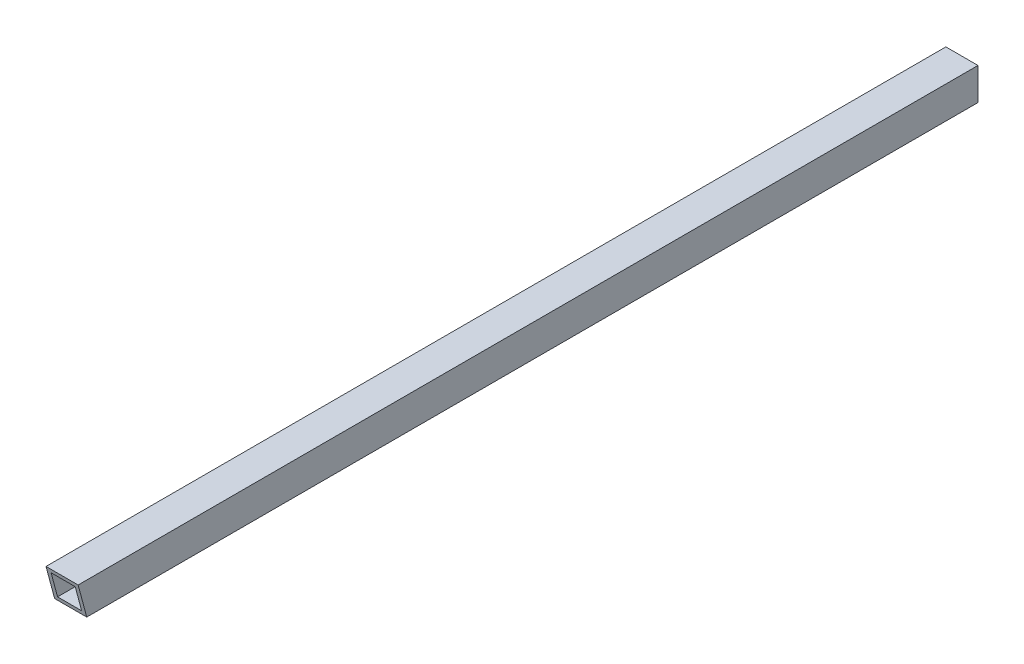
ISO-10303-21;
HEADER;
FILE_DESCRIPTION(('STEP AP214'),'2;1');
FILE_NAME('part.step','',(''),(''),'','','');
FILE_SCHEMA(('AUTOMOTIVE_DESIGN { 1 0 10303 214 1 1 1 1 }'));
ENDSEC;
DATA;
#1=APPLICATION_CONTEXT('core data for automotive mechanical design processes');
#2=APPLICATION_PROTOCOL_DEFINITION('international standard','automotive_design',2000,#1);
#3=PRODUCT_CONTEXT('',#1,'mechanical');
#4=PRODUCT('Part','Part','',(#3));
#5=PRODUCT_RELATED_PRODUCT_CATEGORY('part','',(#4));
#6=PRODUCT_DEFINITION_FORMATION('','',#4);
#7=PRODUCT_DEFINITION_CONTEXT('part definition',#1,'design');
#8=PRODUCT_DEFINITION('design','',#6,#7);
#9=PRODUCT_DEFINITION_SHAPE('','',#8);
#10=(LENGTH_UNIT() NAMED_UNIT(*) SI_UNIT(.MILLI.,.METRE.));
#11=(NAMED_UNIT(*) PLANE_ANGLE_UNIT() SI_UNIT($,.RADIAN.));
#12=(NAMED_UNIT(*) SI_UNIT($,.STERADIAN.) SOLID_ANGLE_UNIT());
#13=UNCERTAINTY_MEASURE_WITH_UNIT(LENGTH_MEASURE(1.E-05),#10,'distance_accuracy_value','');
#14=(GEOMETRIC_REPRESENTATION_CONTEXT(3) GLOBAL_UNCERTAINTY_ASSIGNED_CONTEXT((#13)) GLOBAL_UNIT_ASSIGNED_CONTEXT((#10,
#11,#12)) REPRESENTATION_CONTEXT('',''));
#15=CARTESIAN_POINT('',(0.,0.,0.));
#16=DIRECTION('',(0.,0.,1.));
#17=DIRECTION('',(1.,0.,0.));
#18=AXIS2_PLACEMENT_3D('',#15,#16,#17);
#19=CARTESIAN_POINT('',(0.,0.,0.));
#20=DIRECTION('',(0.,0.,1.));
#21=DIRECTION('',(1.,0.,0.));
#22=AXIS2_PLACEMENT_3D('',#19,#20,#21);
#23=PLANE('',#22);
#24=DIRECTION('',(0.,-1.,0.));
#25=VECTOR('',#24,1.);
#26=CARTESIAN_POINT('',(-12.7,-12.7,0.));
#27=LINE('',#26,#25);
#28=CARTESIAN_POINT('',(-12.7,12.7,0.));
#29=VERTEX_POINT('',#28);
#30=CARTESIAN_POINT('',(-12.7,-12.7,0.));
#31=VERTEX_POINT('',#30);
#32=EDGE_CURVE('E135',#29,#31,#27,.T.);
#33=ORIENTED_EDGE('',*,*,#32,.F.);
#34=DIRECTION('',(-1.,0.,0.));
#35=VECTOR('',#34,1.);
#36=CARTESIAN_POINT('',(12.7,12.7,0.));
#37=LINE('',#36,#35);
#38=CARTESIAN_POINT('',(12.7,12.7,0.));
#39=VERTEX_POINT('',#38);
#40=EDGE_CURVE('E108',#39,#29,#37,.T.);
#41=ORIENTED_EDGE('',*,*,#40,.F.);
#42=DIRECTION('',(0.,1.,0.));
#43=VECTOR('',#42,1.);
#44=CARTESIAN_POINT('',(12.7,-12.7,0.));
#45=LINE('',#44,#43);
#46=CARTESIAN_POINT('',(12.7,-12.7,0.));
#47=VERTEX_POINT('',#46);
#48=EDGE_CURVE('E136',#47,#39,#45,.T.);
#49=ORIENTED_EDGE('',*,*,#48,.F.);
#50=DIRECTION('',(1.,0.,0.));
#51=VECTOR('',#50,1.);
#52=CARTESIAN_POINT('',(12.7,-12.7,0.));
#53=LINE('',#52,#51);
#54=EDGE_CURVE('E131',#31,#47,#53,.T.);
#55=ORIENTED_EDGE('',*,*,#54,.F.);
#56=EDGE_LOOP('',(#33,#41,#49,#55));
#57=FACE_BOUND('',#56,.T.);
#58=DIRECTION('',(0.,-1.,0.));
#59=VECTOR('',#58,1.);
#60=CARTESIAN_POINT('',(-9.525,-9.525,0.));
#61=LINE('',#60,#59);
#62=CARTESIAN_POINT('',(-9.525,9.52500000000001,0.));
#63=VERTEX_POINT('',#62);
#64=CARTESIAN_POINT('',(-9.525,-9.525,0.));
#65=VERTEX_POINT('',#64);
#66=EDGE_CURVE('E152',#63,#65,#61,.T.);
#67=ORIENTED_EDGE('',*,*,#66,.T.);
#68=DIRECTION('',(1.,0.,0.));
#69=VECTOR('',#68,1.);
#70=CARTESIAN_POINT('',(9.525,-9.525,0.));
#71=LINE('',#70,#69);
#72=CARTESIAN_POINT('',(9.525,-9.525,0.));
#73=VERTEX_POINT('',#72);
#74=EDGE_CURVE('E155',#65,#73,#71,.T.);
#75=ORIENTED_EDGE('',*,*,#74,.T.);
#76=DIRECTION('',(0.,1.,0.));
#77=VECTOR('',#76,1.);
#78=CARTESIAN_POINT('',(9.525,-9.525,0.));
#79=LINE('',#78,#77);
#80=CARTESIAN_POINT('',(9.525,9.52500000000001,0.));
#81=VERTEX_POINT('',#80);
#82=EDGE_CURVE('E158',#73,#81,#79,.T.);
#83=ORIENTED_EDGE('',*,*,#82,.T.);
#84=DIRECTION('',(-1.,0.,0.));
#85=VECTOR('',#84,1.);
#86=CARTESIAN_POINT('',(9.525,9.52500000000001,0.));
#87=LINE('',#86,#85);
#88=EDGE_CURVE('E161',#81,#63,#87,.T.);
#89=ORIENTED_EDGE('',*,*,#88,.T.);
#90=EDGE_LOOP('',(#67,#75,#83,#89));
#91=FACE_BOUND('',#90,.T.);
#92=ADVANCED_FACE('F32',(#57,#91),#23,.F.);
#93=CARTESIAN_POINT('',(-12.7,-12.7,711.2));
#94=DIRECTION('',(1.,0.,0.));
#95=DIRECTION('',(0.,0.,-1.));
#96=AXIS2_PLACEMENT_3D('',#93,#94,#95);
#97=PLANE('',#96);
#98=DIRECTION('',(0.,0.,-1.));
#99=VECTOR('',#98,1.);
#100=CARTESIAN_POINT('',(-12.7,-12.7,711.2));
#101=LINE('',#100,#99);
#102=CARTESIAN_POINT('',(-12.7,-12.7000000000001,704.39409051225));
#103=VERTEX_POINT('',#102);
#104=EDGE_CURVE('E40',#103,#31,#101,.T.);
#105=ORIENTED_EDGE('',*,*,#104,.F.);
#106=DIRECTION('',(0.,-0.965925826289072,-0.258819045102508));
#107=VECTOR('',#106,1.);
#108=CARTESIAN_POINT('',(-12.7,-12.7000000000001,704.39409051225));
#109=LINE('',#108,#107);
#110=CARTESIAN_POINT('',(-12.7,12.7,711.2));
#111=VERTEX_POINT('',#110);
#112=EDGE_CURVE('E99',#111,#103,#109,.T.);
#113=ORIENTED_EDGE('',*,*,#112,.F.);
#114=DIRECTION('',(0.,0.,-1.));
#115=VECTOR('',#114,1.);
#116=CARTESIAN_POINT('',(-12.7,12.7,711.2));
#117=LINE('',#116,#115);
#118=EDGE_CURVE('E107',#111,#29,#117,.T.);
#119=ORIENTED_EDGE('',*,*,#118,.T.);
#120=ORIENTED_EDGE('',*,*,#32,.T.);
#121=EDGE_LOOP('',(#105,#113,#119,#120));
#122=FACE_BOUND('',#121,.T.);
#123=ADVANCED_FACE('F34',(#122),#97,.F.);
#124=CARTESIAN_POINT('',(12.7,-12.7,711.2));
#125=DIRECTION('',(0.,1.,0.));
#126=DIRECTION('',(-1.,0.,0.));
#127=AXIS2_PLACEMENT_3D('',#124,#125,#126);
#128=PLANE('',#127);
#129=DIRECTION('',(0.,0.,-1.));
#130=VECTOR('',#129,1.);
#131=CARTESIAN_POINT('',(12.7,-12.7,711.2));
#132=LINE('',#131,#130);
#133=CARTESIAN_POINT('',(12.7,-12.7000000000001,704.39409051225));
#134=VERTEX_POINT('',#133);
#135=EDGE_CURVE('E121',#134,#47,#132,.T.);
#136=ORIENTED_EDGE('',*,*,#135,.F.);
#137=DIRECTION('',(1.,0.,0.));
#138=VECTOR('',#137,1.);
#139=CARTESIAN_POINT('',(12.7,-12.7000000000001,704.39409051225));
#140=LINE('',#139,#138);
#141=EDGE_CURVE('E115',#103,#134,#140,.T.);
#142=ORIENTED_EDGE('',*,*,#141,.F.);
#143=ORIENTED_EDGE('',*,*,#104,.T.);
#144=ORIENTED_EDGE('',*,*,#54,.T.);
#145=EDGE_LOOP('',(#136,#142,#143,#144));
#146=FACE_BOUND('',#145,.T.);
#147=ADVANCED_FACE('F130',(#146),#128,.F.);
#148=CARTESIAN_POINT('',(12.7,-12.7,711.2));
#149=DIRECTION('',(-1.,0.,0.));
#150=DIRECTION('',(0.,0.,1.));
#151=AXIS2_PLACEMENT_3D('',#148,#149,#150);
#152=PLANE('',#151);
#153=DIRECTION('',(0.,0.,-1.));
#154=VECTOR('',#153,1.);
#155=CARTESIAN_POINT('',(12.7,12.7,711.2));
#156=LINE('',#155,#154);
#157=CARTESIAN_POINT('',(12.7,12.7,711.2));
#158=VERTEX_POINT('',#157);
#159=EDGE_CURVE('E119',#158,#39,#156,.T.);
#160=ORIENTED_EDGE('',*,*,#159,.F.);
#161=DIRECTION('',(0.,0.965925826289072,0.258819045102508));
#162=VECTOR('',#161,1.);
#163=CARTESIAN_POINT('',(12.7,12.7,711.2));
#164=LINE('',#163,#162);
#165=EDGE_CURVE('E102',#134,#158,#164,.T.);
#166=ORIENTED_EDGE('',*,*,#165,.F.);
#167=ORIENTED_EDGE('',*,*,#135,.T.);
#168=ORIENTED_EDGE('',*,*,#48,.T.);
#169=EDGE_LOOP('',(#160,#166,#167,#168));
#170=FACE_BOUND('',#169,.T.);
#171=ADVANCED_FACE('F143',(#170),#152,.F.);
#172=CARTESIAN_POINT('',(12.7,12.7,711.2));
#173=DIRECTION('',(0.,-1.,0.));
#174=DIRECTION('',(1.,0.,0.));
#175=AXIS2_PLACEMENT_3D('',#172,#173,#174);
#176=PLANE('',#175);
#177=ORIENTED_EDGE('',*,*,#40,.T.);
#178=ORIENTED_EDGE('',*,*,#118,.F.);
#179=DIRECTION('',(-1.,0.,0.));
#180=VECTOR('',#179,1.);
#181=CARTESIAN_POINT('',(12.7,12.7,711.2));
#182=LINE('',#181,#180);
#183=EDGE_CURVE('E96',#158,#111,#182,.T.);
#184=ORIENTED_EDGE('',*,*,#183,.F.);
#185=ORIENTED_EDGE('',*,*,#159,.T.);
#186=EDGE_LOOP('',(#177,#178,#184,#185));
#187=FACE_BOUND('',#186,.T.);
#188=ADVANCED_FACE('F117',(#187),#176,.F.);
#189=CARTESIAN_POINT('',(-9.525,-9.525,711.2));
#190=DIRECTION('',(1.,0.,0.));
#191=DIRECTION('',(0.,0.,-1.));
#192=AXIS2_PLACEMENT_3D('',#189,#190,#191);
#193=PLANE('',#192);
#194=DIRECTION('',(0.,0.965925826289072,0.258819045102508));
#195=VECTOR('',#194,1.);
#196=CARTESIAN_POINT('',(-9.525,-8.03620729955474,705.64375));
#197=LINE('',#196,#195);
#198=CARTESIAN_POINT('',(-9.525,-9.525,705.244829198219));
#199=VERTEX_POINT('',#198);
#200=CARTESIAN_POINT('',(-9.525,9.52500000000001,710.349261314031));
#201=VERTEX_POINT('',#200);
#202=EDGE_CURVE('E46',#199,#201,#197,.T.);
#203=ORIENTED_EDGE('',*,*,#202,.F.);
#204=DIRECTION('',(0.,0.,-1.));
#205=VECTOR('',#204,1.);
#206=CARTESIAN_POINT('',(-9.525,-9.525,711.2));
#207=LINE('',#206,#205);
#208=EDGE_CURVE('E138',#199,#65,#207,.T.);
#209=ORIENTED_EDGE('',*,*,#208,.T.);
#210=ORIENTED_EDGE('',*,*,#66,.F.);
#211=DIRECTION('',(0.,0.,-1.));
#212=VECTOR('',#211,1.);
#213=CARTESIAN_POINT('',(-9.525,9.52500000000001,711.2));
#214=LINE('',#213,#212);
#215=EDGE_CURVE('E53',#201,#63,#214,.T.);
#216=ORIENTED_EDGE('',*,*,#215,.F.);
#217=EDGE_LOOP('',(#203,#209,#210,#216));
#218=FACE_BOUND('',#217,.T.);
#219=ADVANCED_FACE('F179',(#218),#193,.T.);
#220=CARTESIAN_POINT('',(9.525,-9.525,711.2));
#221=DIRECTION('',(0.,1.,0.));
#222=DIRECTION('',(0.,0.,1.));
#223=AXIS2_PLACEMENT_3D('',#220,#221,#222);
#224=PLANE('',#223);
#225=DIRECTION('',(-1.,0.,0.));
#226=VECTOR('',#225,1.);
#227=CARTESIAN_POINT('',(9.525,-9.525,705.244829198219));
#228=LINE('',#227,#226);
#229=CARTESIAN_POINT('',(9.525,-9.525,705.244829198219));
#230=VERTEX_POINT('',#229);
#231=EDGE_CURVE('E149',#230,#199,#228,.T.);
#232=ORIENTED_EDGE('',*,*,#231,.F.);
#233=DIRECTION('',(0.,0.,-1.));
#234=VECTOR('',#233,1.);
#235=CARTESIAN_POINT('',(9.525,-9.525,711.2));
#236=LINE('',#235,#234);
#237=EDGE_CURVE('E140',#230,#73,#236,.T.);
#238=ORIENTED_EDGE('',*,*,#237,.T.);
#239=ORIENTED_EDGE('',*,*,#74,.F.);
#240=ORIENTED_EDGE('',*,*,#208,.F.);
#241=EDGE_LOOP('',(#232,#238,#239,#240));
#242=FACE_BOUND('',#241,.T.);
#243=ADVANCED_FACE('F172',(#242),#224,.T.);
#244=CARTESIAN_POINT('',(9.525,-9.525,711.2));
#245=DIRECTION('',(-1.,0.,0.));
#246=DIRECTION('',(0.,0.,1.));
#247=AXIS2_PLACEMENT_3D('',#244,#245,#246);
#248=PLANE('',#247);
#249=DIRECTION('',(0.,-0.965925826289072,-0.258819045102508));
#250=VECTOR('',#249,1.);
#251=CARTESIAN_POINT('',(9.525,-8.03620729955474,705.64375));
#252=LINE('',#251,#250);
#253=CARTESIAN_POINT('',(9.525,9.52500000000001,710.349261314031));
#254=VERTEX_POINT('',#253);
#255=EDGE_CURVE('E147',#254,#230,#252,.T.);
#256=ORIENTED_EDGE('',*,*,#255,.F.);
#257=DIRECTION('',(0.,0.,-1.));
#258=VECTOR('',#257,1.);
#259=CARTESIAN_POINT('',(9.525,9.52500000000001,711.2));
#260=LINE('',#259,#258);
#261=EDGE_CURVE('E165',#254,#81,#260,.T.);
#262=ORIENTED_EDGE('',*,*,#261,.T.);
#263=ORIENTED_EDGE('',*,*,#82,.F.);
#264=ORIENTED_EDGE('',*,*,#237,.F.);
#265=EDGE_LOOP('',(#256,#262,#263,#264));
#266=FACE_BOUND('',#265,.T.);
#267=ADVANCED_FACE('F176',(#266),#248,.T.);
#268=CARTESIAN_POINT('',(9.525,9.52500000000001,711.2));
#269=DIRECTION('',(0.,-1.,0.));
#270=DIRECTION('',(0.,0.,-1.));
#271=AXIS2_PLACEMENT_3D('',#268,#269,#270);
#272=PLANE('',#271);
#273=DIRECTION('',(1.,0.,0.));
#274=VECTOR('',#273,1.);
#275=CARTESIAN_POINT('',(9.525,9.52500000000001,710.349261314031));
#276=LINE('',#275,#274);
#277=EDGE_CURVE('E11',#201,#254,#276,.T.);
#278=ORIENTED_EDGE('',*,*,#277,.F.);
#279=ORIENTED_EDGE('',*,*,#215,.T.);
#280=ORIENTED_EDGE('',*,*,#88,.F.);
#281=ORIENTED_EDGE('',*,*,#261,.F.);
#282=EDGE_LOOP('',(#278,#279,#280,#281));
#283=FACE_BOUND('',#282,.T.);
#284=ADVANCED_FACE('F227',(#283),#272,.T.);
#285=CARTESIAN_POINT('',(0.,-176.949261314023,660.383633585751));
#286=DIRECTION('',(0.,0.258819045102508,-0.965925826289072));
#287=DIRECTION('',(0.,0.965925826289072,0.258819045102508));
#288=AXIS2_PLACEMENT_3D('',#285,#286,#287);
#289=PLANE('',#288);
#290=ORIENTED_EDGE('',*,*,#202,.T.);
#291=ORIENTED_EDGE('',*,*,#277,.T.);
#292=ORIENTED_EDGE('',*,*,#255,.T.);
#293=ORIENTED_EDGE('',*,*,#231,.T.);
#294=EDGE_LOOP('',(#290,#291,#292,#293));
#295=FACE_BOUND('',#294,.T.);
#296=ORIENTED_EDGE('',*,*,#165,.T.);
#297=ORIENTED_EDGE('',*,*,#183,.T.);
#298=ORIENTED_EDGE('',*,*,#112,.T.);
#299=ORIENTED_EDGE('',*,*,#141,.T.);
#300=EDGE_LOOP('',(#296,#297,#298,#299));
#301=FACE_BOUND('',#300,.T.);
#302=ADVANCED_FACE('F98',(#295,#301),#289,.F.);
#303=CLOSED_SHELL('',(#92,#123,#147,#171,#188,#219,#243,#267,#284,#302));
#304=MANIFOLD_SOLID_BREP('B2',#303);
#305=ADVANCED_BREP_SHAPE_REPRESENTATION('',(#18,#304),#14);
#306=SHAPE_DEFINITION_REPRESENTATION(#9,#305);
ENDSEC;
END-ISO-10303-21;
